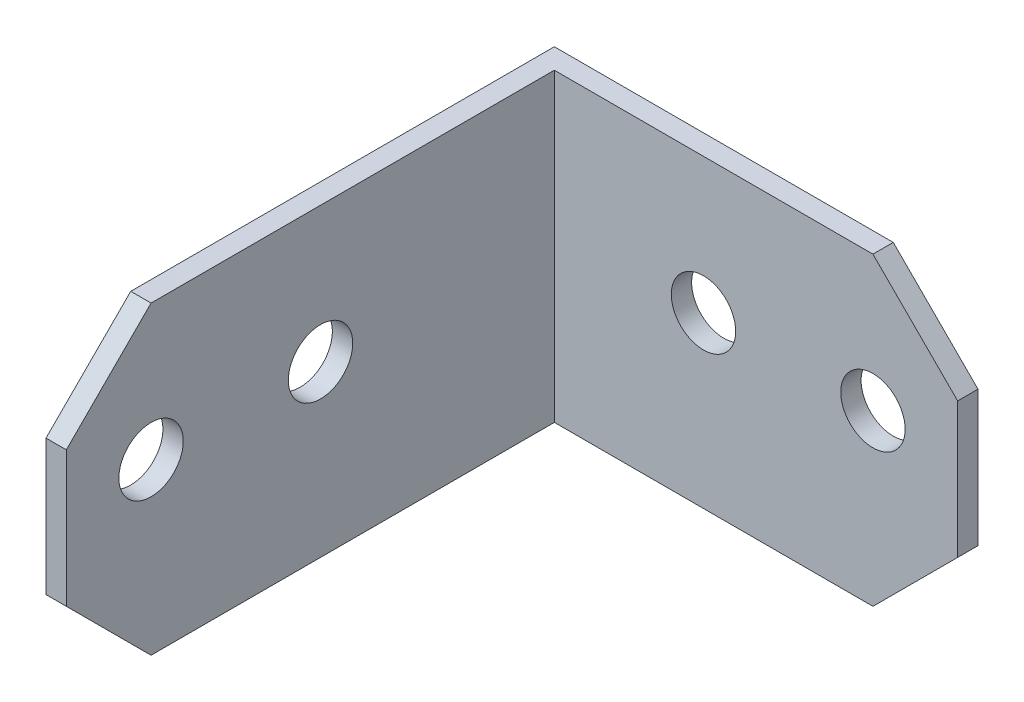
ISO-10303-21;
HEADER;
FILE_DESCRIPTION(('STEP AP214'),'2;1');
FILE_NAME('part.step','',(''),(''),'','','');
FILE_SCHEMA(('AUTOMOTIVE_DESIGN { 1 0 10303 214 1 1 1 1 }'));
ENDSEC;
DATA;
#1=APPLICATION_CONTEXT('core data for automotive mechanical design processes');
#2=APPLICATION_PROTOCOL_DEFINITION('international standard','automotive_design',2000,#1);
#3=PRODUCT_CONTEXT('',#1,'mechanical');
#4=PRODUCT('Part','Part','',(#3));
#5=PRODUCT_RELATED_PRODUCT_CATEGORY('part','',(#4));
#6=PRODUCT_DEFINITION_FORMATION('','',#4);
#7=PRODUCT_DEFINITION_CONTEXT('part definition',#1,'design');
#8=PRODUCT_DEFINITION('design','',#6,#7);
#9=PRODUCT_DEFINITION_SHAPE('','',#8);
#10=(LENGTH_UNIT() NAMED_UNIT(*) SI_UNIT(.MILLI.,.METRE.));
#11=(NAMED_UNIT(*) PLANE_ANGLE_UNIT() SI_UNIT($,.RADIAN.));
#12=(NAMED_UNIT(*) SI_UNIT($,.STERADIAN.) SOLID_ANGLE_UNIT());
#13=UNCERTAINTY_MEASURE_WITH_UNIT(LENGTH_MEASURE(1.E-05),#10,'distance_accuracy_value','');
#14=(GEOMETRIC_REPRESENTATION_CONTEXT(3) GLOBAL_UNCERTAINTY_ASSIGNED_CONTEXT((#13)) GLOBAL_UNIT_ASSIGNED_CONTEXT((#10,
#11,#12)) REPRESENTATION_CONTEXT('',''));
#15=CARTESIAN_POINT('',(0.,0.,0.));
#16=DIRECTION('',(0.,0.,1.));
#17=DIRECTION('',(1.,0.,0.));
#18=AXIS2_PLACEMENT_3D('',#15,#16,#17);
#19=CARTESIAN_POINT('',(1.524,22.86,0.));
#20=DIRECTION('',(0.,0.,-1.));
#21=DIRECTION('',(-1.,0.,0.));
#22=AXIS2_PLACEMENT_3D('',#19,#20,#21);
#23=PLANE('',#22);
#24=DIRECTION('',(0.,-1.,0.));
#25=VECTOR('',#24,1.);
#26=CARTESIAN_POINT('',(0.,22.86,0.));
#27=LINE('',#26,#25);
#28=CARTESIAN_POINT('',(0.,16.51,0.));
#29=VERTEX_POINT('',#28);
#30=CARTESIAN_POINT('',(0.,6.35,0.));
#31=VERTEX_POINT('',#30);
#32=EDGE_CURVE('E159',#29,#31,#27,.T.);
#33=ORIENTED_EDGE('',*,*,#32,.T.);
#34=DIRECTION('',(1.,0.,0.));
#35=VECTOR('',#34,1.);
#36=CARTESIAN_POINT('',(1.524,6.35,0.));
#37=LINE('',#36,#35);
#38=CARTESIAN_POINT('',(1.524,6.35,0.));
#39=VERTEX_POINT('',#38);
#40=EDGE_CURVE('E191',#31,#39,#37,.T.);
#41=ORIENTED_EDGE('',*,*,#40,.T.);
#42=DIRECTION('',(0.,-1.,0.));
#43=VECTOR('',#42,1.);
#44=CARTESIAN_POINT('',(1.524,22.86,0.));
#45=LINE('',#44,#43);
#46=CARTESIAN_POINT('',(1.524,16.51,0.));
#47=VERTEX_POINT('',#46);
#48=EDGE_CURVE('E145',#47,#39,#45,.T.);
#49=ORIENTED_EDGE('',*,*,#48,.F.);
#50=DIRECTION('',(-1.,0.,0.));
#51=VECTOR('',#50,1.);
#52=CARTESIAN_POINT('',(1.524,16.51,0.));
#53=LINE('',#52,#51);
#54=EDGE_CURVE('E188',#47,#29,#53,.T.);
#55=ORIENTED_EDGE('',*,*,#54,.T.);
#56=EDGE_LOOP('',(#33,#41,#49,#55));
#57=FACE_BOUND('',#56,.T.);
#58=ADVANCED_FACE('F45',(#57),#23,.F.);
#59=CARTESIAN_POINT('',(1.524,22.86,-36.576));
#60=DIRECTION('',(-1.,0.,0.));
#61=DIRECTION('',(0.,0.,1.));
#62=AXIS2_PLACEMENT_3D('',#59,#60,#61);
#63=PLANE('',#62);
#64=CARTESIAN_POINT('',(1.524,12.7,-6.35));
#65=DIRECTION('',(1.,0.,0.));
#66=DIRECTION('',(0.,0.,-1.));
#67=AXIS2_PLACEMENT_3D('',#64,#65,#66);
#68=CIRCLE('',#67,2.413);
#69=CARTESIAN_POINT('',(1.524,12.7,-8.763));
#70=VERTEX_POINT('',#69);
#71=EDGE_CURVE('E429',#70,#70,#68,.T.);
#72=ORIENTED_EDGE('',*,*,#71,.F.);
#73=EDGE_LOOP('',(#72));
#74=FACE_BOUND('',#73,.T.);
#75=CARTESIAN_POINT('',(1.524,12.7,-19.05));
#76=DIRECTION('',(1.,0.,0.));
#77=DIRECTION('',(0.,0.,-1.));
#78=AXIS2_PLACEMENT_3D('',#75,#76,#77);
#79=CIRCLE('',#78,2.413);
#80=CARTESIAN_POINT('',(1.524,12.7,-21.463));
#81=VERTEX_POINT('',#80);
#82=EDGE_CURVE('E436',#81,#81,#79,.T.);
#83=ORIENTED_EDGE('',*,*,#82,.F.);
#84=EDGE_LOOP('',(#83));
#85=FACE_BOUND('',#84,.T.);
#86=ORIENTED_EDGE('',*,*,#48,.T.);
#87=DIRECTION('',(0.,-0.707106781186546,-0.707106781186549));
#88=VECTOR('',#87,1.);
#89=CARTESIAN_POINT('',(1.524,6.35,0.));
#90=LINE('',#89,#88);
#91=CARTESIAN_POINT('',(1.524,0.,-6.35000000000002));
#92=VERTEX_POINT('',#91);
#93=EDGE_CURVE('E198',#39,#92,#90,.T.);
#94=ORIENTED_EDGE('',*,*,#93,.T.);
#95=DIRECTION('',(0.,0.,-1.));
#96=VECTOR('',#95,1.);
#97=CARTESIAN_POINT('',(1.524,0.,-36.576));
#98=LINE('',#97,#96);
#99=CARTESIAN_POINT('',(1.524,0.,-36.576));
#100=VERTEX_POINT('',#99);
#101=EDGE_CURVE('E141',#92,#100,#98,.T.);
#102=ORIENTED_EDGE('',*,*,#101,.T.);
#103=DIRECTION('',(0.,-1.,0.));
#104=VECTOR('',#103,1.);
#105=CARTESIAN_POINT('',(1.524,22.86,-36.576));
#106=LINE('',#105,#104);
#107=CARTESIAN_POINT('',(1.524,22.86,-36.576));
#108=VERTEX_POINT('',#107);
#109=EDGE_CURVE('E137',#108,#100,#106,.T.);
#110=ORIENTED_EDGE('',*,*,#109,.F.);
#111=DIRECTION('',(0.,0.,-1.));
#112=VECTOR('',#111,1.);
#113=CARTESIAN_POINT('',(1.524,22.86,-36.576));
#114=LINE('',#113,#112);
#115=CARTESIAN_POINT('',(1.524,22.86,-6.35));
#116=VERTEX_POINT('',#115);
#117=EDGE_CURVE('E126',#116,#108,#114,.T.);
#118=ORIENTED_EDGE('',*,*,#117,.F.);
#119=DIRECTION('',(0.,0.707106781186549,-0.707106781186546));
#120=VECTOR('',#119,1.);
#121=CARTESIAN_POINT('',(1.524,22.86,-6.35));
#122=LINE('',#121,#120);
#123=EDGE_CURVE('E195',#116,#47,#122,.F.);
#124=ORIENTED_EDGE('',*,*,#123,.T.);
#125=EDGE_LOOP('',(#86,#94,#102,#110,#118,#124));
#126=FACE_BOUND('',#125,.T.);
#127=ADVANCED_FACE('F139',(#74,#85,#126),#63,.F.);
#128=CARTESIAN_POINT('',(31.75,22.86,-36.576));
#129=DIRECTION('',(0.,0.,-1.));
#130=DIRECTION('',(-1.,0.,0.));
#131=AXIS2_PLACEMENT_3D('',#128,#129,#130);
#132=PLANE('',#131);
#133=CARTESIAN_POINT('',(25.4,12.7,-36.576));
#134=DIRECTION('',(0.,0.,1.));
#135=DIRECTION('',(1.,0.,0.));
#136=AXIS2_PLACEMENT_3D('',#133,#134,#135);
#137=CIRCLE('',#136,2.413);
#138=CARTESIAN_POINT('',(27.813,12.7,-36.576));
#139=VERTEX_POINT('',#138);
#140=EDGE_CURVE('E413',#139,#139,#137,.T.);
#141=ORIENTED_EDGE('',*,*,#140,.F.);
#142=EDGE_LOOP('',(#141));
#143=FACE_BOUND('',#142,.T.);
#144=CARTESIAN_POINT('',(12.7,12.7,-36.576));
#145=DIRECTION('',(0.,0.,1.));
#146=DIRECTION('',(1.,0.,0.));
#147=AXIS2_PLACEMENT_3D('',#144,#145,#146);
#148=CIRCLE('',#147,2.413);
#149=CARTESIAN_POINT('',(15.113,12.7,-36.576));
#150=VERTEX_POINT('',#149);
#151=EDGE_CURVE('E416',#150,#150,#148,.T.);
#152=ORIENTED_EDGE('',*,*,#151,.F.);
#153=EDGE_LOOP('',(#152));
#154=FACE_BOUND('',#153,.T.);
#155=DIRECTION('',(1.,0.,0.));
#156=VECTOR('',#155,1.);
#157=CARTESIAN_POINT('',(31.75,0.,-36.576));
#158=LINE('',#157,#156);
#159=CARTESIAN_POINT('',(25.4,0.,-36.576));
#160=VERTEX_POINT('',#159);
#161=EDGE_CURVE('E162',#100,#160,#158,.T.);
#162=ORIENTED_EDGE('',*,*,#161,.T.);
#163=DIRECTION('',(0.707106781186549,0.707106781186546,0.));
#164=VECTOR('',#163,1.);
#165=CARTESIAN_POINT('',(31.75,6.35,-36.576));
#166=LINE('',#165,#164);
#167=CARTESIAN_POINT('',(31.75,6.35,-36.576));
#168=VERTEX_POINT('',#167);
#169=EDGE_CURVE('E227',#160,#168,#166,.T.);
#170=ORIENTED_EDGE('',*,*,#169,.T.);
#171=DIRECTION('',(0.,-1.,0.));
#172=VECTOR('',#171,1.);
#173=CARTESIAN_POINT('',(31.75,22.86,-36.576));
#174=LINE('',#173,#172);
#175=CARTESIAN_POINT('',(31.75,16.51,-36.576));
#176=VERTEX_POINT('',#175);
#177=EDGE_CURVE('E146',#176,#168,#174,.T.);
#178=ORIENTED_EDGE('',*,*,#177,.F.);
#179=DIRECTION('',(0.707106781186546,-0.707106781186549,0.));
#180=VECTOR('',#179,1.);
#181=CARTESIAN_POINT('',(25.4,22.86,-36.576));
#182=LINE('',#181,#180);
#183=CARTESIAN_POINT('',(25.4,22.86,-36.576));
#184=VERTEX_POINT('',#183);
#185=EDGE_CURVE('E62',#176,#184,#182,.F.);
#186=ORIENTED_EDGE('',*,*,#185,.T.);
#187=DIRECTION('',(1.,0.,0.));
#188=VECTOR('',#187,1.);
#189=CARTESIAN_POINT('',(31.75,22.86,-36.576));
#190=LINE('',#189,#188);
#191=EDGE_CURVE('E130',#108,#184,#190,.T.);
#192=ORIENTED_EDGE('',*,*,#191,.F.);
#193=ORIENTED_EDGE('',*,*,#109,.T.);
#194=EDGE_LOOP('',(#162,#170,#178,#186,#192,#193));
#195=FACE_BOUND('',#194,.T.);
#196=ADVANCED_FACE('F148',(#143,#154,#195),#132,.F.);
#197=CARTESIAN_POINT('',(31.75,22.86,-38.1));
#198=DIRECTION('',(-1.,0.,0.));
#199=DIRECTION('',(0.,0.,1.));
#200=AXIS2_PLACEMENT_3D('',#197,#198,#199);
#201=PLANE('',#200);
#202=ORIENTED_EDGE('',*,*,#177,.T.);
#203=DIRECTION('',(0.,0.,-1.));
#204=VECTOR('',#203,1.);
#205=CARTESIAN_POINT('',(31.75,6.35,-38.1));
#206=LINE('',#205,#204);
#207=CARTESIAN_POINT('',(31.75,6.35,-38.1));
#208=VERTEX_POINT('',#207);
#209=EDGE_CURVE('E216',#168,#208,#206,.T.);
#210=ORIENTED_EDGE('',*,*,#209,.T.);
#211=DIRECTION('',(0.,-1.,0.));
#212=VECTOR('',#211,1.);
#213=CARTESIAN_POINT('',(31.75,22.86,-38.1));
#214=LINE('',#213,#212);
#215=CARTESIAN_POINT('',(31.75,16.51,-38.1));
#216=VERTEX_POINT('',#215);
#217=EDGE_CURVE('E179',#216,#208,#214,.T.);
#218=ORIENTED_EDGE('',*,*,#217,.F.);
#219=DIRECTION('',(0.,0.,1.));
#220=VECTOR('',#219,1.);
#221=CARTESIAN_POINT('',(31.75,16.51,-38.1));
#222=LINE('',#221,#220);
#223=EDGE_CURVE('E213',#216,#176,#222,.T.);
#224=ORIENTED_EDGE('',*,*,#223,.T.);
#225=EDGE_LOOP('',(#202,#210,#218,#224));
#226=FACE_BOUND('',#225,.T.);
#227=ADVANCED_FACE('F260',(#226),#201,.F.);
#228=CARTESIAN_POINT('',(0.,22.86,-38.1));
#229=DIRECTION('',(0.,0.,1.));
#230=DIRECTION('',(1.,0.,0.));
#231=AXIS2_PLACEMENT_3D('',#228,#229,#230);
#232=PLANE('',#231);
#233=CARTESIAN_POINT('',(25.4,12.7,-38.1));
#234=DIRECTION('',(0.,0.,1.));
#235=DIRECTION('',(1.,0.,0.));
#236=AXIS2_PLACEMENT_3D('',#233,#234,#235);
#237=CIRCLE('',#236,2.413);
#238=CARTESIAN_POINT('',(27.813,12.7,-38.1));
#239=VERTEX_POINT('',#238);
#240=EDGE_CURVE('E439',#239,#239,#237,.T.);
#241=ORIENTED_EDGE('',*,*,#240,.T.);
#242=EDGE_LOOP('',(#241));
#243=FACE_BOUND('',#242,.T.);
#244=CARTESIAN_POINT('',(12.7,12.7,-38.1));
#245=DIRECTION('',(0.,0.,1.));
#246=DIRECTION('',(1.,0.,0.));
#247=AXIS2_PLACEMENT_3D('',#244,#245,#246);
#248=CIRCLE('',#247,2.413);
#249=CARTESIAN_POINT('',(15.113,12.7,-38.1));
#250=VERTEX_POINT('',#249);
#251=EDGE_CURVE('E419',#250,#250,#248,.T.);
#252=ORIENTED_EDGE('',*,*,#251,.T.);
#253=EDGE_LOOP('',(#252));
#254=FACE_BOUND('',#253,.T.);
#255=ORIENTED_EDGE('',*,*,#217,.T.);
#256=DIRECTION('',(-0.707106781186549,-0.707106781186546,0.));
#257=VECTOR('',#256,1.);
#258=CARTESIAN_POINT('',(31.75,6.35,-38.1));
#259=LINE('',#258,#257);
#260=CARTESIAN_POINT('',(25.4,0.,-38.1));
#261=VERTEX_POINT('',#260);
#262=EDGE_CURVE('E222',#208,#261,#259,.T.);
#263=ORIENTED_EDGE('',*,*,#262,.T.);
#264=DIRECTION('',(-1.,0.,0.));
#265=VECTOR('',#264,1.);
#266=CARTESIAN_POINT('',(0.,0.,-38.1));
#267=LINE('',#266,#265);
#268=CARTESIAN_POINT('',(0.,0.,-38.1));
#269=VERTEX_POINT('',#268);
#270=EDGE_CURVE('E166',#261,#269,#267,.T.);
#271=ORIENTED_EDGE('',*,*,#270,.T.);
#272=DIRECTION('',(0.,-1.,0.));
#273=VECTOR('',#272,1.);
#274=CARTESIAN_POINT('',(0.,22.86,-38.1));
#275=LINE('',#274,#273);
#276=CARTESIAN_POINT('',(0.,22.86,-38.1));
#277=VERTEX_POINT('',#276);
#278=EDGE_CURVE('E175',#277,#269,#275,.T.);
#279=ORIENTED_EDGE('',*,*,#278,.F.);
#280=DIRECTION('',(-1.,0.,0.));
#281=VECTOR('',#280,1.);
#282=CARTESIAN_POINT('',(0.,22.86,-38.1));
#283=LINE('',#282,#281);
#284=CARTESIAN_POINT('',(25.4,22.86,-38.1));
#285=VERTEX_POINT('',#284);
#286=EDGE_CURVE('E150',#285,#277,#283,.T.);
#287=ORIENTED_EDGE('',*,*,#286,.F.);
#288=DIRECTION('',(-0.707106781186546,0.707106781186549,0.));
#289=VECTOR('',#288,1.);
#290=CARTESIAN_POINT('',(25.4,22.86,-38.1));
#291=LINE('',#290,#289);
#292=EDGE_CURVE('E70',#285,#216,#291,.F.);
#293=ORIENTED_EDGE('',*,*,#292,.T.);
#294=EDGE_LOOP('',(#255,#263,#271,#279,#287,#293));
#295=FACE_BOUND('',#294,.T.);
#296=ADVANCED_FACE('F233',(#243,#254,#295),#232,.F.);
#297=CARTESIAN_POINT('',(0.,22.86,0.));
#298=DIRECTION('',(1.,0.,0.));
#299=DIRECTION('',(0.,0.,-1.));
#300=AXIS2_PLACEMENT_3D('',#297,#298,#299);
#301=PLANE('',#300);
#302=CARTESIAN_POINT('',(0.,12.7,-6.35));
#303=DIRECTION('',(1.,0.,0.));
#304=DIRECTION('',(0.,0.,-1.));
#305=AXIS2_PLACEMENT_3D('',#302,#303,#304);
#306=CIRCLE('',#305,2.413);
#307=CARTESIAN_POINT('',(0.,12.7,-8.763));
#308=VERTEX_POINT('',#307);
#309=EDGE_CURVE('E163',#308,#308,#306,.T.);
#310=ORIENTED_EDGE('',*,*,#309,.T.);
#311=EDGE_LOOP('',(#310));
#312=FACE_BOUND('',#311,.T.);
#313=CARTESIAN_POINT('',(0.,12.7,-19.05));
#314=DIRECTION('',(1.,0.,0.));
#315=DIRECTION('',(0.,0.,-1.));
#316=AXIS2_PLACEMENT_3D('',#313,#314,#315);
#317=CIRCLE('',#316,2.413);
#318=CARTESIAN_POINT('',(0.,12.7,-21.463));
#319=VERTEX_POINT('',#318);
#320=EDGE_CURVE('E433',#319,#319,#317,.T.);
#321=ORIENTED_EDGE('',*,*,#320,.T.);
#322=EDGE_LOOP('',(#321));
#323=FACE_BOUND('',#322,.T.);
#324=DIRECTION('',(0.,0.,1.));
#325=VECTOR('',#324,1.);
#326=CARTESIAN_POINT('',(0.,0.,0.));
#327=LINE('',#326,#325);
#328=CARTESIAN_POINT('',(0.,0.,-6.35000000000002));
#329=VERTEX_POINT('',#328);
#330=EDGE_CURVE('E134',#269,#329,#327,.T.);
#331=ORIENTED_EDGE('',*,*,#330,.T.);
#332=DIRECTION('',(0.,0.707106781186546,0.707106781186549));
#333=VECTOR('',#332,1.);
#334=CARTESIAN_POINT('',(0.,6.35,0.));
#335=LINE('',#334,#333);
#336=EDGE_CURVE('E210',#329,#31,#335,.T.);
#337=ORIENTED_EDGE('',*,*,#336,.T.);
#338=ORIENTED_EDGE('',*,*,#32,.F.);
#339=DIRECTION('',(0.,-0.707106781186549,0.707106781186546));
#340=VECTOR('',#339,1.);
#341=CARTESIAN_POINT('',(0.,22.86,-6.35));
#342=LINE('',#341,#340);
#343=CARTESIAN_POINT('',(0.,22.86,-6.35));
#344=VERTEX_POINT('',#343);
#345=EDGE_CURVE('E207',#29,#344,#342,.F.);
#346=ORIENTED_EDGE('',*,*,#345,.T.);
#347=DIRECTION('',(0.,0.,1.));
#348=VECTOR('',#347,1.);
#349=CARTESIAN_POINT('',(0.,22.86,0.));
#350=LINE('',#349,#348);
#351=EDGE_CURVE('E153',#277,#344,#350,.T.);
#352=ORIENTED_EDGE('',*,*,#351,.F.);
#353=ORIENTED_EDGE('',*,*,#278,.T.);
#354=EDGE_LOOP('',(#331,#337,#338,#346,#352,#353));
#355=FACE_BOUND('',#354,.T.);
#356=ADVANCED_FACE('F239',(#312,#323,#355),#301,.F.);
#357=CARTESIAN_POINT('',(0.,22.86,0.));
#358=DIRECTION('',(0.,-1.,0.));
#359=DIRECTION('',(0.,0.,-1.));
#360=AXIS2_PLACEMENT_3D('',#357,#358,#359);
#361=PLANE('',#360);
#362=ORIENTED_EDGE('',*,*,#351,.T.);
#363=DIRECTION('',(1.,0.,0.));
#364=VECTOR('',#363,1.);
#365=CARTESIAN_POINT('',(0.,22.86,-6.35));
#366=LINE('',#365,#364);
#367=EDGE_CURVE('E11',#344,#116,#366,.T.);
#368=ORIENTED_EDGE('',*,*,#367,.T.);
#369=ORIENTED_EDGE('',*,*,#117,.T.);
#370=ORIENTED_EDGE('',*,*,#191,.T.);
#371=DIRECTION('',(0.,0.,-1.));
#372=VECTOR('',#371,1.);
#373=CARTESIAN_POINT('',(25.4,22.86,0.));
#374=LINE('',#373,#372);
#375=EDGE_CURVE('E55',#184,#285,#374,.T.);
#376=ORIENTED_EDGE('',*,*,#375,.T.);
#377=ORIENTED_EDGE('',*,*,#286,.T.);
#378=EDGE_LOOP('',(#362,#368,#369,#370,#376,#377));
#379=FACE_BOUND('',#378,.T.);
#380=ADVANCED_FACE('F129',(#379),#361,.F.);
#381=CARTESIAN_POINT('',(0.,0.,0.));
#382=DIRECTION('',(0.,-1.,0.));
#383=DIRECTION('',(0.,0.,-1.));
#384=AXIS2_PLACEMENT_3D('',#381,#382,#383);
#385=PLANE('',#384);
#386=ORIENTED_EDGE('',*,*,#101,.F.);
#387=DIRECTION('',(-1.,0.,0.));
#388=VECTOR('',#387,1.);
#389=CARTESIAN_POINT('',(0.,0.,-6.35000000000002));
#390=LINE('',#389,#388);
#391=EDGE_CURVE('E204',#92,#329,#390,.T.);
#392=ORIENTED_EDGE('',*,*,#391,.T.);
#393=ORIENTED_EDGE('',*,*,#330,.F.);
#394=ORIENTED_EDGE('',*,*,#270,.F.);
#395=DIRECTION('',(0.,0.,1.));
#396=VECTOR('',#395,1.);
#397=CARTESIAN_POINT('',(25.4,0.,-36.576));
#398=LINE('',#397,#396);
#399=EDGE_CURVE('E201',#261,#160,#398,.T.);
#400=ORIENTED_EDGE('',*,*,#399,.T.);
#401=ORIENTED_EDGE('',*,*,#161,.F.);
#402=EDGE_LOOP('',(#386,#392,#393,#394,#400,#401));
#403=FACE_BOUND('',#402,.T.);
#404=ADVANCED_FACE('F253',(#403),#385,.T.);
#405=CARTESIAN_POINT('',(0.,12.7,-19.05));
#406=DIRECTION('',(1.,0.,0.));
#407=DIRECTION('',(0.,0.,-1.));
#408=AXIS2_PLACEMENT_3D('',#405,#406,#407);
#409=CYLINDRICAL_SURFACE('',#408,2.413);
#410=CARTESIAN_POINT('',(0.,12.7,-21.463));
#411=CARTESIAN_POINT('',(0.0158749999999985,12.7,-21.463));
#412=CARTESIAN_POINT('',(0.0317499999999985,12.7,-21.463));
#413=CARTESIAN_POINT('',(0.0634999999999985,12.7,-21.463));
#414=CARTESIAN_POINT('',(0.0793749999999985,12.7,-21.463));
#415=CARTESIAN_POINT('',(0.111124999999999,12.7,-21.463));
#416=CARTESIAN_POINT('',(0.126999999999999,12.7,-21.463));
#417=CARTESIAN_POINT('',(0.158749999999999,12.7,-21.463));
#418=CARTESIAN_POINT('',(0.174624999999999,12.7,-21.463));
#419=CARTESIAN_POINT('',(0.206374999999999,12.7,-21.463));
#420=CARTESIAN_POINT('',(0.222249999999999,12.7,-21.463));
#421=CARTESIAN_POINT('',(0.253999999999999,12.7,-21.463));
#422=CARTESIAN_POINT('',(0.269874999999999,12.7,-21.463));
#423=CARTESIAN_POINT('',(0.301624999999999,12.7,-21.463));
#424=CARTESIAN_POINT('',(0.317499999999999,12.7,-21.463));
#425=CARTESIAN_POINT('',(0.349249999999999,12.7,-21.463));
#426=CARTESIAN_POINT('',(0.365124999999999,12.7,-21.463));
#427=CARTESIAN_POINT('',(0.396874999999999,12.7,-21.463));
#428=CARTESIAN_POINT('',(0.412749999999999,12.7,-21.463));
#429=CARTESIAN_POINT('',(0.444499999999999,12.7,-21.463));
#430=CARTESIAN_POINT('',(0.460374999999999,12.7,-21.463));
#431=CARTESIAN_POINT('',(0.492124999999999,12.7,-21.463));
#432=CARTESIAN_POINT('',(0.507999999999998,12.7,-21.463));
#433=CARTESIAN_POINT('',(0.539749999999999,12.7,-21.463));
#434=CARTESIAN_POINT('',(0.555624999999998,12.7,-21.463));
#435=CARTESIAN_POINT('',(0.587374999999999,12.7,-21.463));
#436=CARTESIAN_POINT('',(0.603249999999999,12.7,-21.463));
#437=CARTESIAN_POINT('',(0.634999999999999,12.7,-21.463));
#438=CARTESIAN_POINT('',(0.650874999999999,12.7,-21.463));
#439=CARTESIAN_POINT('',(0.682624999999999,12.7,-21.463));
#440=CARTESIAN_POINT('',(0.698499999999998,12.7,-21.463));
#441=CARTESIAN_POINT('',(0.730249999999999,12.7,-21.463));
#442=CARTESIAN_POINT('',(0.746124999999998,12.7,-21.463));
#443=CARTESIAN_POINT('',(0.777874999999999,12.7,-21.463));
#444=CARTESIAN_POINT('',(0.793749999999999,12.7,-21.463));
#445=CARTESIAN_POINT('',(0.825499999999999,12.7,-21.463));
#446=CARTESIAN_POINT('',(0.841374999999999,12.7,-21.463));
#447=CARTESIAN_POINT('',(0.873124999999999,12.7,-21.463));
#448=CARTESIAN_POINT('',(0.888999999999999,12.7,-21.463));
#449=CARTESIAN_POINT('',(0.920749999999999,12.7,-21.463));
#450=CARTESIAN_POINT('',(0.936624999999999,12.7,-21.463));
#451=CARTESIAN_POINT('',(0.968374999999999,12.7,-21.463));
#452=CARTESIAN_POINT('',(0.984249999999998,12.7,-21.463));
#453=CARTESIAN_POINT('',(1.016,12.7,-21.463));
#454=CARTESIAN_POINT('',(1.031875,12.7,-21.463));
#455=CARTESIAN_POINT('',(1.063625,12.7,-21.463));
#456=CARTESIAN_POINT('',(1.0795,12.7,-21.463));
#457=CARTESIAN_POINT('',(1.11125,12.7,-21.463));
#458=CARTESIAN_POINT('',(1.127125,12.7,-21.463));
#459=CARTESIAN_POINT('',(1.158875,12.7,-21.463));
#460=CARTESIAN_POINT('',(1.17475,12.7,-21.463));
#461=CARTESIAN_POINT('',(1.2065,12.7,-21.463));
#462=CARTESIAN_POINT('',(1.222375,12.7,-21.463));
#463=CARTESIAN_POINT('',(1.254125,12.7,-21.463));
#464=CARTESIAN_POINT('',(1.27,12.7,-21.463));
#465=CARTESIAN_POINT('',(1.30175,12.7,-21.463));
#466=CARTESIAN_POINT('',(1.317625,12.7,-21.463));
#467=CARTESIAN_POINT('',(1.349375,12.7,-21.463));
#468=CARTESIAN_POINT('',(1.36525,12.7,-21.463));
#469=CARTESIAN_POINT('',(1.397,12.7,-21.463));
#470=CARTESIAN_POINT('',(1.412875,12.7,-21.463));
#471=CARTESIAN_POINT('',(1.444625,12.7,-21.463));
#472=CARTESIAN_POINT('',(1.4605,12.7,-21.463));
#473=CARTESIAN_POINT('',(1.49225,12.7,-21.463));
#474=CARTESIAN_POINT('',(1.508125,12.7,-21.463));
#475=CARTESIAN_POINT('',(1.524,12.7,-21.463));
#476=B_SPLINE_CURVE_WITH_KNOTS('',3,(#410,#411,#412,#413,#414,#415,#416,#417,#418,#419,#420,
#421,#422,#423,#424,#425,#426,#427,#428,#429,#430,#431,#432,#433,#434,#435,#436,#437,#438,#439,
#440,#441,#442,#443,#444,#445,#446,#447,#448,#449,#450,#451,#452,#453,#454,#455,#456,#457,#458,
#459,#460,#461,#462,#463,#464,#465,#466,#467,#468,#469,#470,#471,#472,#473,#474,#475),
.UNSPECIFIED.,.F.,.F.,(4,2,2,2,2,2,2,2,2,2,2,2,2,2,2,2,2,2,2,2,2,2,2,2,2,2,2,2,2,2,2,2,4),(0.,
0.047625,0.09525,0.142875,0.1905,0.238125,0.28575,0.333375,0.381,0.428625,0.47625,0.523875,
0.5715,0.619125,0.66675,0.714375,0.762,0.809625,0.85725,0.904875,0.9525,1.000125,1.04775,
1.095375,1.143,1.190625,1.23825,1.285875,1.3335,1.381125,1.42875,1.476375,1.524),.UNSPECIFIED.);
#477=EDGE_CURVE('BSEAM336',#319,#81,#476,.T.);
#478=ORIENTED_EDGE('',*,*,#320,.F.);
#479=ORIENTED_EDGE('',*,*,#82,.T.);
#480=ORIENTED_EDGE('',*,*,#477,.T.);
#481=ORIENTED_EDGE('',*,*,#477,.F.);
#482=EDGE_LOOP('',(#478,#480,#479,#481));
#483=FACE_BOUND('',#482,.T.);
#484=ADVANCED_FACE('F336',(#483),#409,.F.);
#485=CARTESIAN_POINT('',(0.,12.7,-6.35));
#486=DIRECTION('',(1.,0.,0.));
#487=DIRECTION('',(0.,0.,-1.));
#488=AXIS2_PLACEMENT_3D('',#485,#486,#487);
#489=CYLINDRICAL_SURFACE('',#488,2.413);
#490=CARTESIAN_POINT('',(0.,12.7,-8.763));
#491=CARTESIAN_POINT('',(0.0158749999999994,12.7,-8.763));
#492=CARTESIAN_POINT('',(0.0317499999999994,12.7,-8.763));
#493=CARTESIAN_POINT('',(0.0634999999999994,12.7,-8.763));
#494=CARTESIAN_POINT('',(0.0793749999999994,12.7,-8.763));
#495=CARTESIAN_POINT('',(0.111124999999999,12.7,-8.763));
#496=CARTESIAN_POINT('',(0.126999999999999,12.7,-8.763));
#497=CARTESIAN_POINT('',(0.158749999999999,12.7,-8.763));
#498=CARTESIAN_POINT('',(0.174624999999999,12.7,-8.763));
#499=CARTESIAN_POINT('',(0.206374999999999,12.7,-8.763));
#500=CARTESIAN_POINT('',(0.222249999999999,12.7,-8.763));
#501=CARTESIAN_POINT('',(0.253999999999999,12.7,-8.763));
#502=CARTESIAN_POINT('',(0.269874999999999,12.7,-8.763));
#503=CARTESIAN_POINT('',(0.301624999999999,12.7,-8.763));
#504=CARTESIAN_POINT('',(0.317499999999999,12.7,-8.763));
#505=CARTESIAN_POINT('',(0.349249999999999,12.7,-8.763));
#506=CARTESIAN_POINT('',(0.365124999999999,12.7,-8.763));
#507=CARTESIAN_POINT('',(0.396874999999999,12.7,-8.763));
#508=CARTESIAN_POINT('',(0.412749999999999,12.7,-8.763));
#509=CARTESIAN_POINT('',(0.444499999999999,12.7,-8.763));
#510=CARTESIAN_POINT('',(0.460374999999999,12.7,-8.763));
#511=CARTESIAN_POINT('',(0.492124999999999,12.7,-8.763));
#512=CARTESIAN_POINT('',(0.507999999999999,12.7,-8.763));
#513=CARTESIAN_POINT('',(0.539749999999999,12.7,-8.763));
#514=CARTESIAN_POINT('',(0.555624999999999,12.7,-8.763));
#515=CARTESIAN_POINT('',(0.587374999999999,12.7,-8.763));
#516=CARTESIAN_POINT('',(0.603249999999999,12.7,-8.763));
#517=CARTESIAN_POINT('',(0.634999999999999,12.7,-8.763));
#518=CARTESIAN_POINT('',(0.650874999999999,12.7,-8.763));
#519=CARTESIAN_POINT('',(0.682624999999999,12.7,-8.763));
#520=CARTESIAN_POINT('',(0.698499999999999,12.7,-8.763));
#521=CARTESIAN_POINT('',(0.730249999999999,12.7,-8.763));
#522=CARTESIAN_POINT('',(0.746124999999999,12.7,-8.763));
#523=CARTESIAN_POINT('',(0.777875,12.7,-8.763));
#524=CARTESIAN_POINT('',(0.793749999999999,12.7,-8.763));
#525=CARTESIAN_POINT('',(0.8255,12.7,-8.763));
#526=CARTESIAN_POINT('',(0.841374999999999,12.7,-8.763));
#527=CARTESIAN_POINT('',(0.873124999999999,12.7,-8.763));
#528=CARTESIAN_POINT('',(0.888999999999999,12.7,-8.763));
#529=CARTESIAN_POINT('',(0.92075,12.7,-8.763));
#530=CARTESIAN_POINT('',(0.936624999999999,12.7,-8.763));
#531=CARTESIAN_POINT('',(0.968374999999999,12.7,-8.763));
#532=CARTESIAN_POINT('',(0.984249999999999,12.7,-8.763));
#533=CARTESIAN_POINT('',(1.016,12.7,-8.763));
#534=CARTESIAN_POINT('',(1.031875,12.7,-8.763));
#535=CARTESIAN_POINT('',(1.063625,12.7,-8.763));
#536=CARTESIAN_POINT('',(1.0795,12.7,-8.763));
#537=CARTESIAN_POINT('',(1.11125,12.7,-8.763));
#538=CARTESIAN_POINT('',(1.127125,12.7,-8.763));
#539=CARTESIAN_POINT('',(1.158875,12.7,-8.763));
#540=CARTESIAN_POINT('',(1.17475,12.7,-8.763));
#541=CARTESIAN_POINT('',(1.2065,12.7,-8.763));
#542=CARTESIAN_POINT('',(1.222375,12.7,-8.763));
#543=CARTESIAN_POINT('',(1.254125,12.7,-8.763));
#544=CARTESIAN_POINT('',(1.27,12.7,-8.763));
#545=CARTESIAN_POINT('',(1.30175,12.7,-8.763));
#546=CARTESIAN_POINT('',(1.317625,12.7,-8.763));
#547=CARTESIAN_POINT('',(1.349375,12.7,-8.763));
#548=CARTESIAN_POINT('',(1.36525,12.7,-8.763));
#549=CARTESIAN_POINT('',(1.397,12.7,-8.763));
#550=CARTESIAN_POINT('',(1.412875,12.7,-8.763));
#551=CARTESIAN_POINT('',(1.444625,12.7,-8.763));
#552=CARTESIAN_POINT('',(1.4605,12.7,-8.763));
#553=CARTESIAN_POINT('',(1.49225,12.7,-8.763));
#554=CARTESIAN_POINT('',(1.508125,12.7,-8.763));
#555=CARTESIAN_POINT('',(1.524,12.7,-8.763));
#556=B_SPLINE_CURVE_WITH_KNOTS('',3,(#490,#491,#492,#493,#494,#495,#496,#497,#498,#499,#500,
#501,#502,#503,#504,#505,#506,#507,#508,#509,#510,#511,#512,#513,#514,#515,#516,#517,#518,#519,
#520,#521,#522,#523,#524,#525,#526,#527,#528,#529,#530,#531,#532,#533,#534,#535,#536,#537,#538,
#539,#540,#541,#542,#543,#544,#545,#546,#547,#548,#549,#550,#551,#552,#553,#554,#555),
.UNSPECIFIED.,.F.,.F.,(4,2,2,2,2,2,2,2,2,2,2,2,2,2,2,2,2,2,2,2,2,2,2,2,2,2,2,2,2,2,2,2,4),(0.,
0.047625,0.09525,0.142875,0.1905,0.238125,0.28575,0.333375,0.381,0.428625,0.47625,0.523875,
0.5715,0.619125,0.66675,0.714375,0.762,0.809625,0.85725,0.904875,0.9525,1.000125,1.04775,
1.095375,1.143,1.190625,1.23825,1.285875,1.3335,1.381125,1.42875,1.476375,1.524),.UNSPECIFIED.);
#557=EDGE_CURVE('BSEAM327',#308,#70,#556,.T.);
#558=ORIENTED_EDGE('',*,*,#309,.F.);
#559=ORIENTED_EDGE('',*,*,#71,.T.);
#560=ORIENTED_EDGE('',*,*,#557,.T.);
#561=ORIENTED_EDGE('',*,*,#557,.F.);
#562=EDGE_LOOP('',(#558,#560,#559,#561));
#563=FACE_BOUND('',#562,.T.);
#564=ADVANCED_FACE('F327',(#563),#489,.F.);
#565=CARTESIAN_POINT('',(12.7,12.7,-38.1));
#566=DIRECTION('',(0.,0.,1.));
#567=DIRECTION('',(1.,0.,0.));
#568=AXIS2_PLACEMENT_3D('',#565,#566,#567);
#569=CYLINDRICAL_SURFACE('',#568,2.413);
#570=ORIENTED_EDGE('',*,*,#251,.F.);
#571=EDGE_LOOP('',(#570));
#572=FACE_BOUND('',#571,.T.);
#573=ORIENTED_EDGE('',*,*,#151,.T.);
#574=EDGE_LOOP('',(#573));
#575=FACE_BOUND('',#574,.T.);
#576=ADVANCED_FACE('F318',(#572,#575),#569,.F.);
#577=CARTESIAN_POINT('',(25.4,12.7,-38.1));
#578=DIRECTION('',(0.,0.,1.));
#579=DIRECTION('',(1.,0.,0.));
#580=AXIS2_PLACEMENT_3D('',#577,#578,#579);
#581=CYLINDRICAL_SURFACE('',#580,2.413);
#582=ORIENTED_EDGE('',*,*,#240,.F.);
#583=EDGE_LOOP('',(#582));
#584=FACE_BOUND('',#583,.T.);
#585=ORIENTED_EDGE('',*,*,#140,.T.);
#586=EDGE_LOOP('',(#585));
#587=FACE_BOUND('',#586,.T.);
#588=ADVANCED_FACE('F280',(#584,#587),#581,.F.);
#589=CARTESIAN_POINT('',(1.524,6.35,0.));
#590=DIRECTION('',(0.,-0.707106781186549,0.707106781186546));
#591=DIRECTION('',(-1.,0.,0.));
#592=AXIS2_PLACEMENT_3D('',#589,#590,#591);
#593=PLANE('',#592);
#594=ORIENTED_EDGE('',*,*,#336,.F.);
#595=ORIENTED_EDGE('',*,*,#391,.F.);
#596=ORIENTED_EDGE('',*,*,#93,.F.);
#597=ORIENTED_EDGE('',*,*,#40,.F.);
#598=EDGE_LOOP('',(#594,#595,#596,#597));
#599=FACE_BOUND('',#598,.T.);
#600=ADVANCED_FACE('F250',(#599),#593,.T.);
#601=CARTESIAN_POINT('',(31.75,6.35,-38.1));
#602=DIRECTION('',(0.707106781186546,-0.707106781186549,0.));
#603=DIRECTION('',(0.,0.,1.));
#604=AXIS2_PLACEMENT_3D('',#601,#602,#603);
#605=PLANE('',#604);
#606=ORIENTED_EDGE('',*,*,#169,.F.);
#607=ORIENTED_EDGE('',*,*,#399,.F.);
#608=ORIENTED_EDGE('',*,*,#262,.F.);
#609=ORIENTED_EDGE('',*,*,#209,.F.);
#610=EDGE_LOOP('',(#606,#607,#608,#609));
#611=FACE_BOUND('',#610,.T.);
#612=ADVANCED_FACE('F258',(#611),#605,.T.);
#613=CARTESIAN_POINT('',(0.,22.86,-6.35));
#614=DIRECTION('',(0.,-0.707106781186546,-0.707106781186549));
#615=DIRECTION('',(1.,0.,0.));
#616=AXIS2_PLACEMENT_3D('',#613,#614,#615);
#617=PLANE('',#616);
#618=ORIENTED_EDGE('',*,*,#345,.F.);
#619=ORIENTED_EDGE('',*,*,#54,.F.);
#620=ORIENTED_EDGE('',*,*,#123,.F.);
#621=ORIENTED_EDGE('',*,*,#367,.F.);
#622=EDGE_LOOP('',(#618,#619,#620,#621));
#623=FACE_BOUND('',#622,.T.);
#624=ADVANCED_FACE('F243',(#623),#617,.F.);
#625=CARTESIAN_POINT('',(25.4,22.86,0.));
#626=DIRECTION('',(-0.707106781186549,-0.707106781186546,0.));
#627=DIRECTION('',(0.,0.,-1.));
#628=AXIS2_PLACEMENT_3D('',#625,#626,#627);
#629=PLANE('',#628);
#630=ORIENTED_EDGE('',*,*,#185,.F.);
#631=ORIENTED_EDGE('',*,*,#223,.F.);
#632=ORIENTED_EDGE('',*,*,#292,.F.);
#633=ORIENTED_EDGE('',*,*,#375,.F.);
#634=EDGE_LOOP('',(#630,#631,#632,#633));
#635=FACE_BOUND('',#634,.T.);
#636=ADVANCED_FACE('F48',(#635),#629,.F.);
#637=CLOSED_SHELL('',(#58,#127,#196,#227,#296,#356,#380,#404,#484,#564,#576,#588,#600,#612,#624,#636));
#638=MANIFOLD_SOLID_BREP('B2',#637);
#639=ADVANCED_BREP_SHAPE_REPRESENTATION('',(#18,#638),#14);
#640=SHAPE_DEFINITION_REPRESENTATION(#9,#639);
ENDSEC;
END-ISO-10303-21;
